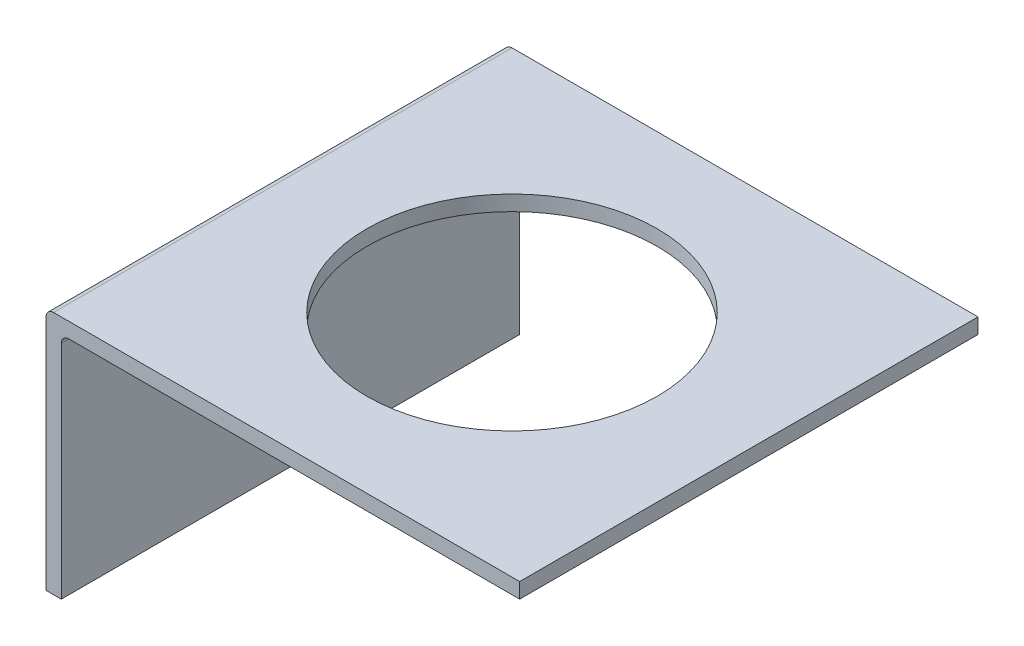
ISO-10303-21;
HEADER;
FILE_DESCRIPTION(('STEP AP214'),'2;1');
FILE_NAME('part.step','',(''),(''),'','','');
FILE_SCHEMA(('AUTOMOTIVE_DESIGN { 1 0 10303 214 1 1 1 1 }'));
ENDSEC;
DATA;
#1=APPLICATION_CONTEXT('core data for automotive mechanical design processes');
#2=APPLICATION_PROTOCOL_DEFINITION('international standard','automotive_design',2000,#1);
#3=PRODUCT_CONTEXT('',#1,'mechanical');
#4=PRODUCT('Part','Part','',(#3));
#5=PRODUCT_RELATED_PRODUCT_CATEGORY('part','',(#4));
#6=PRODUCT_DEFINITION_FORMATION('','',#4);
#7=PRODUCT_DEFINITION_CONTEXT('part definition',#1,'design');
#8=PRODUCT_DEFINITION('design','',#6,#7);
#9=PRODUCT_DEFINITION_SHAPE('','',#8);
#10=(LENGTH_UNIT() NAMED_UNIT(*) SI_UNIT(.MILLI.,.METRE.));
#11=(NAMED_UNIT(*) PLANE_ANGLE_UNIT() SI_UNIT($,.RADIAN.));
#12=(NAMED_UNIT(*) SI_UNIT($,.STERADIAN.) SOLID_ANGLE_UNIT());
#13=UNCERTAINTY_MEASURE_WITH_UNIT(LENGTH_MEASURE(1.E-05),#10,'distance_accuracy_value','');
#14=(GEOMETRIC_REPRESENTATION_CONTEXT(3) GLOBAL_UNCERTAINTY_ASSIGNED_CONTEXT((#13)) GLOBAL_UNIT_ASSIGNED_CONTEXT((#10,
#11,#12)) REPRESENTATION_CONTEXT('',''));
#15=CARTESIAN_POINT('',(0.,0.,0.));
#16=DIRECTION('',(0.,0.,1.));
#17=DIRECTION('',(1.,0.,0.));
#18=AXIS2_PLACEMENT_3D('',#15,#16,#17);
#19=CARTESIAN_POINT('',(0.,0.,0.));
#20=DIRECTION('',(0.,-1.,0.));
#21=DIRECTION('',(0.,0.,-1.));
#22=AXIS2_PLACEMENT_3D('',#19,#20,#21);
#23=PLANE('',#22);
#24=CARTESIAN_POINT('',(0.,0.,0.));
#25=DIRECTION('',(0.,-1.,0.));
#26=DIRECTION('',(0.,0.,-1.));
#27=AXIS2_PLACEMENT_3D('',#24,#25,#26);
#28=CIRCLE('',#27,19.);
#29=CARTESIAN_POINT('',(0.,0.,-19.));
#30=VERTEX_POINT('',#29);
#31=EDGE_CURVE('E126',#30,#30,#28,.T.);
#32=ORIENTED_EDGE('',*,*,#31,.F.);
#33=EDGE_LOOP('',(#32));
#34=FACE_BOUND('',#33,.T.);
#35=DIRECTION('',(1.,0.,0.));
#36=VECTOR('',#35,1.);
#37=CARTESIAN_POINT('',(-31.,0.,30.));
#38=LINE('',#37,#36);
#39=CARTESIAN_POINT('',(-28.,0.,30.));
#40=VERTEX_POINT('',#39);
#41=CARTESIAN_POINT('',(31.,0.,30.));
#42=VERTEX_POINT('',#41);
#43=EDGE_CURVE('E139',#40,#42,#38,.T.);
#44=ORIENTED_EDGE('',*,*,#43,.F.);
#45=DIRECTION('',(0.,0.,1.));
#46=VECTOR('',#45,1.);
#47=CARTESIAN_POINT('',(-28.,0.,0.));
#48=LINE('',#47,#46);
#49=CARTESIAN_POINT('',(-28.,0.,-29.9958987433513));
#50=VERTEX_POINT('',#49);
#51=EDGE_CURVE('E180',#40,#50,#48,.F.);
#52=ORIENTED_EDGE('',*,*,#51,.T.);
#53=DIRECTION('',(-1.,0.,0.));
#54=VECTOR('',#53,1.);
#55=CARTESIAN_POINT('',(-29.,0.,-29.9958987433513));
#56=LINE('',#55,#54);
#57=CARTESIAN_POINT('',(-31.,0.,-29.9958987433513));
#58=VERTEX_POINT('',#57);
#59=EDGE_CURVE('E49',#50,#58,#56,.T.);
#60=ORIENTED_EDGE('',*,*,#59,.T.);
#61=DIRECTION('',(0.,0.,1.));
#62=VECTOR('',#61,1.);
#63=CARTESIAN_POINT('',(-31.,0.,30.));
#64=LINE('',#63,#62);
#65=CARTESIAN_POINT('',(-31.,0.,-30.));
#66=VERTEX_POINT('',#65);
#67=EDGE_CURVE('E109',#66,#58,#64,.T.);
#68=ORIENTED_EDGE('',*,*,#67,.F.);
#69=DIRECTION('',(-1.,0.,0.));
#70=VECTOR('',#69,1.);
#71=CARTESIAN_POINT('',(-31.,0.,-30.));
#72=LINE('',#71,#70);
#73=CARTESIAN_POINT('',(31.,0.,-30.));
#74=VERTEX_POINT('',#73);
#75=EDGE_CURVE('E147',#74,#66,#72,.T.);
#76=ORIENTED_EDGE('',*,*,#75,.F.);
#77=DIRECTION('',(0.,0.,-1.));
#78=VECTOR('',#77,1.);
#79=CARTESIAN_POINT('',(31.,0.,30.));
#80=LINE('',#79,#78);
#81=EDGE_CURVE('E134',#42,#74,#80,.T.);
#82=ORIENTED_EDGE('',*,*,#81,.F.);
#83=EDGE_LOOP('',(#44,#52,#60,#68,#76,#82));
#84=FACE_BOUND('',#83,.T.);
#85=ADVANCED_FACE('F35',(#34,#84),#23,.T.);
#86=CARTESIAN_POINT('',(31.,2.,30.));
#87=DIRECTION('',(-1.,0.,0.));
#88=DIRECTION('',(0.,0.,1.));
#89=AXIS2_PLACEMENT_3D('',#86,#87,#88);
#90=PLANE('',#89);
#91=ORIENTED_EDGE('',*,*,#81,.T.);
#92=DIRECTION('',(0.,-1.,0.));
#93=VECTOR('',#92,1.);
#94=CARTESIAN_POINT('',(31.,2.,-30.));
#95=LINE('',#94,#93);
#96=CARTESIAN_POINT('',(31.,2.,-30.));
#97=VERTEX_POINT('',#96);
#98=EDGE_CURVE('E157',#97,#74,#95,.T.);
#99=ORIENTED_EDGE('',*,*,#98,.F.);
#100=DIRECTION('',(0.,0.,-1.));
#101=VECTOR('',#100,1.);
#102=CARTESIAN_POINT('',(31.,2.,30.));
#103=LINE('',#102,#101);
#104=CARTESIAN_POINT('',(31.,2.,30.));
#105=VERTEX_POINT('',#104);
#106=EDGE_CURVE('E135',#105,#97,#103,.T.);
#107=ORIENTED_EDGE('',*,*,#106,.F.);
#108=DIRECTION('',(0.,-1.,0.));
#109=VECTOR('',#108,1.);
#110=CARTESIAN_POINT('',(31.,2.,30.));
#111=LINE('',#110,#109);
#112=EDGE_CURVE('E144',#105,#42,#111,.T.);
#113=ORIENTED_EDGE('',*,*,#112,.T.);
#114=EDGE_LOOP('',(#91,#99,#107,#113));
#115=FACE_BOUND('',#114,.T.);
#116=ADVANCED_FACE('F201',(#115),#90,.F.);
#117=CARTESIAN_POINT('',(-31.,2.,-30.));
#118=DIRECTION('',(0.,0.,1.));
#119=DIRECTION('',(1.,0.,0.));
#120=AXIS2_PLACEMENT_3D('',#117,#118,#119);
#121=PLANE('',#120);
#122=DIRECTION('',(0.,-1.,0.));
#123=VECTOR('',#122,1.);
#124=CARTESIAN_POINT('',(-31.,2.,-30.));
#125=LINE('',#124,#123);
#126=CARTESIAN_POINT('',(-31.,1.,-30.));
#127=VERTEX_POINT('',#126);
#128=EDGE_CURVE('E197',#127,#66,#125,.T.);
#129=ORIENTED_EDGE('',*,*,#128,.F.);
#130=CARTESIAN_POINT('',(-30.,1.,-30.));
#131=DIRECTION('',(0.,0.,1.));
#132=DIRECTION('',(1.,0.,0.));
#133=AXIS2_PLACEMENT_3D('',#130,#131,#132);
#134=CIRCLE('',#133,1.);
#135=CARTESIAN_POINT('',(-30.,2.,-30.));
#136=VERTEX_POINT('',#135);
#137=EDGE_CURVE('E175',#127,#136,#134,.F.);
#138=ORIENTED_EDGE('',*,*,#137,.T.);
#139=DIRECTION('',(-1.,0.,0.));
#140=VECTOR('',#139,1.);
#141=CARTESIAN_POINT('',(-31.,2.,-30.));
#142=LINE('',#141,#140);
#143=EDGE_CURVE('E138',#97,#136,#142,.T.);
#144=ORIENTED_EDGE('',*,*,#143,.F.);
#145=ORIENTED_EDGE('',*,*,#98,.T.);
#146=ORIENTED_EDGE('',*,*,#75,.T.);
#147=EDGE_LOOP('',(#129,#138,#144,#145,#146));
#148=FACE_BOUND('',#147,.T.);
#149=ADVANCED_FACE('F211',(#148),#121,.F.);
#150=CARTESIAN_POINT('',(-31.,2.,30.));
#151=DIRECTION('',(1.,0.,0.));
#152=DIRECTION('',(0.,0.,-1.));
#153=AXIS2_PLACEMENT_3D('',#150,#151,#152);
#154=PLANE('',#153);
#155=DIRECTION('',(0.,-1.,0.));
#156=VECTOR('',#155,1.);
#157=CARTESIAN_POINT('',(-31.,2.,30.));
#158=LINE('',#157,#156);
#159=CARTESIAN_POINT('',(-31.,1.,30.));
#160=VERTEX_POINT('',#159);
#161=CARTESIAN_POINT('',(-31.,-30.,30.));
#162=VERTEX_POINT('',#161);
#163=EDGE_CURVE('E195',#160,#162,#158,.T.);
#164=ORIENTED_EDGE('',*,*,#163,.F.);
#165=DIRECTION('',(0.,0.,1.));
#166=VECTOR('',#165,1.);
#167=CARTESIAN_POINT('',(-31.,1.,30.));
#168=LINE('',#167,#166);
#169=EDGE_CURVE('E173',#160,#127,#168,.F.);
#170=ORIENTED_EDGE('',*,*,#169,.T.);
#171=ORIENTED_EDGE('',*,*,#128,.T.);
#172=ORIENTED_EDGE('',*,*,#67,.T.);
#173=DIRECTION('',(0.,1.,0.));
#174=VECTOR('',#173,1.);
#175=CARTESIAN_POINT('',(-31.,-30.,-29.9958987433513));
#176=LINE('',#175,#174);
#177=CARTESIAN_POINT('',(-31.,-30.,-29.9958987433513));
#178=VERTEX_POINT('',#177);
#179=EDGE_CURVE('E103',#178,#58,#176,.T.);
#180=ORIENTED_EDGE('',*,*,#179,.F.);
#181=DIRECTION('',(0.,0.,1.));
#182=VECTOR('',#181,1.);
#183=CARTESIAN_POINT('',(-31.,-30.,-29.9958987433513));
#184=LINE('',#183,#182);
#185=EDGE_CURVE('E107',#178,#162,#184,.T.);
#186=ORIENTED_EDGE('',*,*,#185,.T.);
#187=EDGE_LOOP('',(#164,#170,#171,#172,#180,#186));
#188=FACE_BOUND('',#187,.T.);
#189=ADVANCED_FACE('F106',(#188),#154,.F.);
#190=CARTESIAN_POINT('',(-31.,2.,30.));
#191=DIRECTION('',(0.,0.,-1.));
#192=DIRECTION('',(-1.,0.,0.));
#193=AXIS2_PLACEMENT_3D('',#190,#191,#192);
#194=PLANE('',#193);
#195=DIRECTION('',(1.,0.,0.));
#196=VECTOR('',#195,1.);
#197=CARTESIAN_POINT('',(-31.,2.,30.));
#198=LINE('',#197,#196);
#199=CARTESIAN_POINT('',(-30.,2.,30.));
#200=VERTEX_POINT('',#199);
#201=EDGE_CURVE('E142',#200,#105,#198,.T.);
#202=ORIENTED_EDGE('',*,*,#201,.F.);
#203=CARTESIAN_POINT('',(-30.,1.,30.));
#204=DIRECTION('',(0.,0.,-1.));
#205=DIRECTION('',(-1.,0.,0.));
#206=AXIS2_PLACEMENT_3D('',#203,#204,#205);
#207=CIRCLE('',#206,1.);
#208=EDGE_CURVE('E170',#200,#160,#207,.F.);
#209=ORIENTED_EDGE('',*,*,#208,.T.);
#210=ORIENTED_EDGE('',*,*,#163,.T.);
#211=DIRECTION('',(-1.,0.,0.));
#212=VECTOR('',#211,1.);
#213=CARTESIAN_POINT('',(-29.,-30.,30.));
#214=LINE('',#213,#212);
#215=CARTESIAN_POINT('',(-29.,-30.,30.));
#216=VERTEX_POINT('',#215);
#217=EDGE_CURVE('E120',#216,#162,#214,.T.);
#218=ORIENTED_EDGE('',*,*,#217,.F.);
#219=DIRECTION('',(0.,1.,0.));
#220=VECTOR('',#219,1.);
#221=CARTESIAN_POINT('',(-29.,-30.,30.));
#222=LINE('',#221,#220);
#223=CARTESIAN_POINT('',(-29.,-1.,30.));
#224=VERTEX_POINT('',#223);
#225=EDGE_CURVE('E111',#216,#224,#222,.T.);
#226=ORIENTED_EDGE('',*,*,#225,.T.);
#227=CARTESIAN_POINT('',(-28.,-1.,30.));
#228=DIRECTION('',(0.,0.,-1.));
#229=DIRECTION('',(-1.,0.,0.));
#230=AXIS2_PLACEMENT_3D('',#227,#228,#229);
#231=CIRCLE('',#230,1.);
#232=EDGE_CURVE('E43',#224,#40,#231,.T.);
#233=ORIENTED_EDGE('',*,*,#232,.T.);
#234=ORIENTED_EDGE('',*,*,#43,.T.);
#235=ORIENTED_EDGE('',*,*,#112,.F.);
#236=EDGE_LOOP('',(#202,#209,#210,#218,#226,#233,#234,#235));
#237=FACE_BOUND('',#236,.T.);
#238=ADVANCED_FACE('F184',(#237),#194,.F.);
#239=CARTESIAN_POINT('',(0.,2.,0.));
#240=DIRECTION('',(0.,-1.,0.));
#241=DIRECTION('',(0.,0.,-1.));
#242=AXIS2_PLACEMENT_3D('',#239,#240,#241);
#243=PLANE('',#242);
#244=CARTESIAN_POINT('',(0.,2.,0.));
#245=DIRECTION('',(0.,1.,0.));
#246=DIRECTION('',(0.,0.,1.));
#247=AXIS2_PLACEMENT_3D('',#244,#245,#246);
#248=CIRCLE('',#247,19.);
#249=CARTESIAN_POINT('',(0.,2.,19.));
#250=VERTEX_POINT('',#249);
#251=EDGE_CURVE('E240',#250,#250,#248,.T.);
#252=ORIENTED_EDGE('',*,*,#251,.F.);
#253=EDGE_LOOP('',(#252));
#254=FACE_BOUND('',#253,.T.);
#255=ORIENTED_EDGE('',*,*,#143,.T.);
#256=DIRECTION('',(0.,0.,1.));
#257=VECTOR('',#256,1.);
#258=CARTESIAN_POINT('',(-30.,2.,0.));
#259=LINE('',#258,#257);
#260=EDGE_CURVE('E167',#136,#200,#259,.T.);
#261=ORIENTED_EDGE('',*,*,#260,.T.);
#262=ORIENTED_EDGE('',*,*,#201,.T.);
#263=ORIENTED_EDGE('',*,*,#106,.T.);
#264=EDGE_LOOP('',(#255,#261,#262,#263));
#265=FACE_BOUND('',#264,.T.);
#266=ADVANCED_FACE('F204',(#254,#265),#243,.F.);
#267=CARTESIAN_POINT('',(-29.,-30.,-29.9958987433513));
#268=DIRECTION('',(0.,0.,-1.));
#269=DIRECTION('',(-1.,0.,0.));
#270=AXIS2_PLACEMENT_3D('',#267,#268,#269);
#271=PLANE('',#270);
#272=ORIENTED_EDGE('',*,*,#59,.F.);
#273=CARTESIAN_POINT('',(-28.,-1.,-29.9958987433513));
#274=DIRECTION('',(0.,0.,-1.));
#275=DIRECTION('',(-1.,0.,0.));
#276=AXIS2_PLACEMENT_3D('',#273,#274,#275);
#277=CIRCLE('',#276,1.);
#278=CARTESIAN_POINT('',(-29.,-1.,-29.9958987433513));
#279=VERTEX_POINT('',#278);
#280=EDGE_CURVE('E11',#50,#279,#277,.F.);
#281=ORIENTED_EDGE('',*,*,#280,.T.);
#282=DIRECTION('',(0.,1.,0.));
#283=VECTOR('',#282,1.);
#284=CARTESIAN_POINT('',(-29.,-30.,-29.9958987433513));
#285=LINE('',#284,#283);
#286=CARTESIAN_POINT('',(-29.,-30.,-29.9958987433513));
#287=VERTEX_POINT('',#286);
#288=EDGE_CURVE('E123',#287,#279,#285,.T.);
#289=ORIENTED_EDGE('',*,*,#288,.F.);
#290=DIRECTION('',(-1.,0.,0.));
#291=VECTOR('',#290,1.);
#292=CARTESIAN_POINT('',(-29.,-30.,-29.9958987433513));
#293=LINE('',#292,#291);
#294=EDGE_CURVE('E118',#287,#178,#293,.T.);
#295=ORIENTED_EDGE('',*,*,#294,.T.);
#296=ORIENTED_EDGE('',*,*,#179,.T.);
#297=EDGE_LOOP('',(#272,#281,#289,#295,#296));
#298=FACE_BOUND('',#297,.T.);
#299=ADVANCED_FACE('F122',(#298),#271,.T.);
#300=CARTESIAN_POINT('',(-29.,-30.,-29.9958987433513));
#301=DIRECTION('',(-1.,0.,0.));
#302=DIRECTION('',(0.,0.,1.));
#303=AXIS2_PLACEMENT_3D('',#300,#301,#302);
#304=PLANE('',#303);
#305=ORIENTED_EDGE('',*,*,#288,.T.);
#306=DIRECTION('',(0.,0.,1.));
#307=VECTOR('',#306,1.);
#308=CARTESIAN_POINT('',(-29.,-1.,-29.9958987433513));
#309=LINE('',#308,#307);
#310=EDGE_CURVE('E177',#279,#224,#309,.T.);
#311=ORIENTED_EDGE('',*,*,#310,.T.);
#312=ORIENTED_EDGE('',*,*,#225,.F.);
#313=DIRECTION('',(0.,0.,1.));
#314=VECTOR('',#313,1.);
#315=CARTESIAN_POINT('',(-29.,-30.,-29.9958987433513));
#316=LINE('',#315,#314);
#317=EDGE_CURVE('E112',#287,#216,#316,.T.);
#318=ORIENTED_EDGE('',*,*,#317,.F.);
#319=EDGE_LOOP('',(#305,#311,#312,#318));
#320=FACE_BOUND('',#319,.T.);
#321=ADVANCED_FACE('F194',(#320),#304,.F.);
#322=CARTESIAN_POINT('',(0.,-30.,0.));
#323=DIRECTION('',(0.,1.,0.));
#324=DIRECTION('',(0.,0.,1.));
#325=AXIS2_PLACEMENT_3D('',#322,#323,#324);
#326=PLANE('',#325);
#327=ORIENTED_EDGE('',*,*,#294,.F.);
#328=ORIENTED_EDGE('',*,*,#317,.T.);
#329=ORIENTED_EDGE('',*,*,#217,.T.);
#330=ORIENTED_EDGE('',*,*,#185,.F.);
#331=EDGE_LOOP('',(#327,#328,#329,#330));
#332=FACE_BOUND('',#331,.T.);
#333=ADVANCED_FACE('F117',(#332),#326,.F.);
#334=CARTESIAN_POINT('',(-30.,1.,0.));
#335=DIRECTION('',(0.,0.,1.));
#336=DIRECTION('',(1.,0.,0.));
#337=AXIS2_PLACEMENT_3D('',#334,#335,#336);
#338=CYLINDRICAL_SURFACE('',#337,1.);
#339=ORIENTED_EDGE('',*,*,#137,.F.);
#340=ORIENTED_EDGE('',*,*,#169,.F.);
#341=ORIENTED_EDGE('',*,*,#208,.F.);
#342=ORIENTED_EDGE('',*,*,#260,.F.);
#343=EDGE_LOOP('',(#339,#340,#341,#342));
#344=FACE_BOUND('',#343,.T.);
#345=ADVANCED_FACE('F208',(#344),#338,.T.);
#346=CARTESIAN_POINT('',(-28.,-1.,-29.9958987433513));
#347=DIRECTION('',(0.,0.,1.));
#348=DIRECTION('',(1.,0.,0.));
#349=AXIS2_PLACEMENT_3D('',#346,#347,#348);
#350=CYLINDRICAL_SURFACE('',#349,1.);
#351=ORIENTED_EDGE('',*,*,#280,.F.);
#352=ORIENTED_EDGE('',*,*,#51,.F.);
#353=ORIENTED_EDGE('',*,*,#232,.F.);
#354=ORIENTED_EDGE('',*,*,#310,.F.);
#355=EDGE_LOOP('',(#351,#352,#353,#354));
#356=FACE_BOUND('',#355,.T.);
#357=ADVANCED_FACE('F37',(#356),#350,.F.);
#358=CARTESIAN_POINT('',(0.,-30.000025,0.));
#359=DIRECTION('',(0.,1.,0.));
#360=DIRECTION('',(0.,0.,1.));
#361=AXIS2_PLACEMENT_3D('',#358,#359,#360);
#362=CYLINDRICAL_SURFACE('',#361,19.);
#363=ORIENTED_EDGE('',*,*,#31,.T.);
#364=EDGE_LOOP('',(#363));
#365=FACE_BOUND('',#364,.T.);
#366=ORIENTED_EDGE('',*,*,#251,.T.);
#367=EDGE_LOOP('',(#366));
#368=FACE_BOUND('',#367,.T.);
#369=ADVANCED_FACE('F244',(#365,#368),#362,.F.);
#370=CLOSED_SHELL('',(#85,#116,#149,#189,#238,#266,#299,#321,#333,#345,#357,#369));
#371=MANIFOLD_SOLID_BREP('B2',#370);
#372=ADVANCED_BREP_SHAPE_REPRESENTATION('',(#18,#371),#14);
#373=SHAPE_DEFINITION_REPRESENTATION(#9,#372);
ENDSEC;
END-ISO-10303-21;
